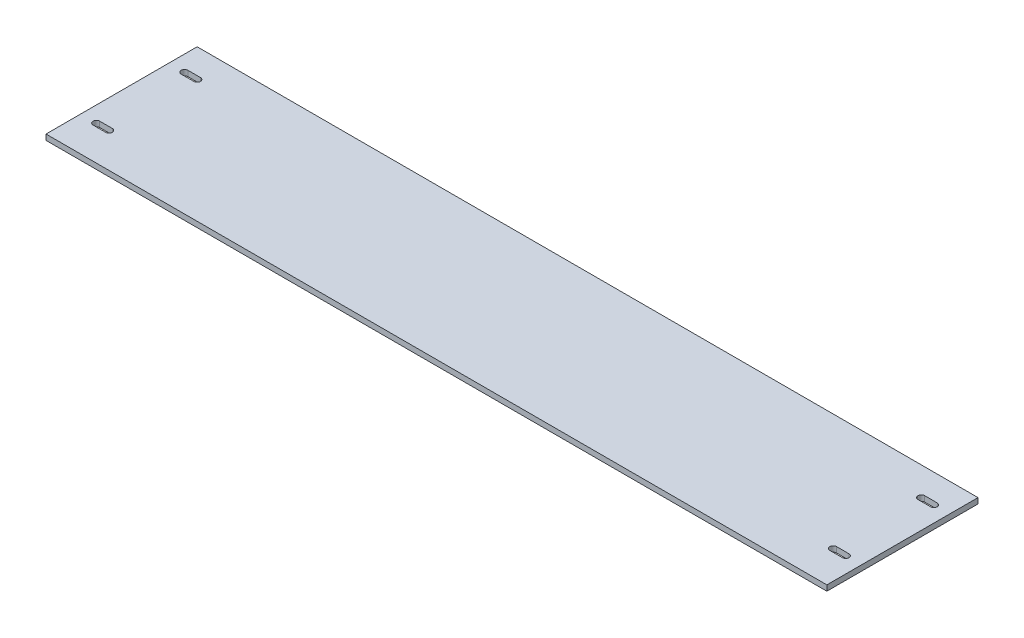
ISO-10303-21;
HEADER;
FILE_DESCRIPTION(('STEP AP214'),'2;1');
FILE_NAME('part.step','',(''),(''),'','','');
FILE_SCHEMA(('AUTOMOTIVE_DESIGN { 1 0 10303 214 1 1 1 1 }'));
ENDSEC;
DATA;
#1=APPLICATION_CONTEXT('core data for automotive mechanical design processes');
#2=APPLICATION_PROTOCOL_DEFINITION('international standard','automotive_design',2000,#1);
#3=PRODUCT_CONTEXT('',#1,'mechanical');
#4=PRODUCT('Part','Part','',(#3));
#5=PRODUCT_RELATED_PRODUCT_CATEGORY('part','',(#4));
#6=PRODUCT_DEFINITION_FORMATION('','',#4);
#7=PRODUCT_DEFINITION_CONTEXT('part definition',#1,'design');
#8=PRODUCT_DEFINITION('design','',#6,#7);
#9=PRODUCT_DEFINITION_SHAPE('','',#8);
#10=(LENGTH_UNIT() NAMED_UNIT(*) SI_UNIT(.MILLI.,.METRE.));
#11=(NAMED_UNIT(*) PLANE_ANGLE_UNIT() SI_UNIT($,.RADIAN.));
#12=(NAMED_UNIT(*) SI_UNIT($,.STERADIAN.) SOLID_ANGLE_UNIT());
#13=UNCERTAINTY_MEASURE_WITH_UNIT(LENGTH_MEASURE(1.E-05),#10,'distance_accuracy_value','');
#14=(GEOMETRIC_REPRESENTATION_CONTEXT(3) GLOBAL_UNCERTAINTY_ASSIGNED_CONTEXT((#13)) GLOBAL_UNIT_ASSIGNED_CONTEXT((#10,
#11,#12)) REPRESENTATION_CONTEXT('',''));
#15=CARTESIAN_POINT('',(0.,0.,0.));
#16=DIRECTION('',(0.,0.,1.));
#17=DIRECTION('',(1.,0.,0.));
#18=AXIS2_PLACEMENT_3D('',#15,#16,#17);
#19=CARTESIAN_POINT('',(0.,5.588,0.));
#20=DIRECTION('',(0.,-1.,0.));
#21=DIRECTION('',(0.,0.,-1.));
#22=AXIS2_PLACEMENT_3D('',#19,#20,#21);
#23=PLANE('',#22);
#24=CARTESIAN_POINT('',(771.525,5.588,-123.825));
#25=DIRECTION('',(0.,1.,0.));
#26=DIRECTION('',(0.,0.,1.));
#27=AXIS2_PLACEMENT_3D('',#24,#25,#26);
#28=CIRCLE('',#27,3.37819999999999);
#29=CARTESIAN_POINT('',(771.525,5.588,-120.4468));
#30=VERTEX_POINT('',#29);
#31=CARTESIAN_POINT('',(771.525,5.588,-127.2032));
#32=VERTEX_POINT('',#31);
#33=EDGE_CURVE('E206',#30,#32,#28,.T.);
#34=ORIENTED_EDGE('',*,*,#33,.F.);
#35=DIRECTION('',(1.,0.,0.));
#36=VECTOR('',#35,1.);
#37=CARTESIAN_POINT('',(771.525,5.588,-120.4468));
#38=LINE('',#37,#36);
#39=CARTESIAN_POINT('',(758.825,5.588,-120.4468));
#40=VERTEX_POINT('',#39);
#41=EDGE_CURVE('E214',#40,#30,#38,.T.);
#42=ORIENTED_EDGE('',*,*,#41,.F.);
#43=CARTESIAN_POINT('',(758.825,5.588,-123.825));
#44=DIRECTION('',(0.,1.,0.));
#45=DIRECTION('',(0.,0.,1.));
#46=AXIS2_PLACEMENT_3D('',#43,#44,#45);
#47=CIRCLE('',#46,3.37819999999999);
#48=CARTESIAN_POINT('',(758.825,5.588,-127.2032));
#49=VERTEX_POINT('',#48);
#50=EDGE_CURVE('E211',#49,#40,#47,.T.);
#51=ORIENTED_EDGE('',*,*,#50,.F.);
#52=DIRECTION('',(-1.,0.,0.));
#53=VECTOR('',#52,1.);
#54=CARTESIAN_POINT('',(771.525,5.588,-127.2032));
#55=LINE('',#54,#53);
#56=EDGE_CURVE('E208',#32,#49,#55,.T.);
#57=ORIENTED_EDGE('',*,*,#56,.F.);
#58=EDGE_LOOP('',(#34,#42,#51,#57));
#59=FACE_BOUND('',#58,.T.);
#60=CARTESIAN_POINT('',(15.875,5.588,-34.925));
#61=DIRECTION('',(0.,1.,0.));
#62=DIRECTION('',(0.,0.,1.));
#63=AXIS2_PLACEMENT_3D('',#60,#61,#62);
#64=CIRCLE('',#63,3.3782);
#65=CARTESIAN_POINT('',(15.875,5.588,-38.3032));
#66=VERTEX_POINT('',#65);
#67=CARTESIAN_POINT('',(15.875,5.588,-31.5468));
#68=VERTEX_POINT('',#67);
#69=EDGE_CURVE('E268',#66,#68,#64,.T.);
#70=ORIENTED_EDGE('',*,*,#69,.F.);
#71=DIRECTION('',(-1.,0.,0.));
#72=VECTOR('',#71,1.);
#73=CARTESIAN_POINT('',(15.875,5.588,-38.3032));
#74=LINE('',#73,#72);
#75=CARTESIAN_POINT('',(28.575,5.588,-38.3032));
#76=VERTEX_POINT('',#75);
#77=EDGE_CURVE('E276',#76,#66,#74,.T.);
#78=ORIENTED_EDGE('',*,*,#77,.F.);
#79=CARTESIAN_POINT('',(28.575,5.588,-34.925));
#80=DIRECTION('',(0.,1.,0.));
#81=DIRECTION('',(0.,0.,1.));
#82=AXIS2_PLACEMENT_3D('',#79,#80,#81);
#83=CIRCLE('',#82,3.3782);
#84=CARTESIAN_POINT('',(28.575,5.588,-31.5468));
#85=VERTEX_POINT('',#84);
#86=EDGE_CURVE('E273',#85,#76,#83,.T.);
#87=ORIENTED_EDGE('',*,*,#86,.F.);
#88=DIRECTION('',(1.,0.,0.));
#89=VECTOR('',#88,1.);
#90=CARTESIAN_POINT('',(15.875,5.588,-31.5468));
#91=LINE('',#90,#89);
#92=EDGE_CURVE('E270',#68,#85,#91,.T.);
#93=ORIENTED_EDGE('',*,*,#92,.F.);
#94=EDGE_LOOP('',(#70,#78,#87,#93));
#95=FACE_BOUND('',#94,.T.);
#96=DIRECTION('',(0.,0.,1.));
#97=VECTOR('',#96,1.);
#98=CARTESIAN_POINT('',(0.,5.588,0.));
#99=LINE('',#98,#97);
#100=CARTESIAN_POINT('',(0.,5.588,-152.4));
#101=VERTEX_POINT('',#100);
#102=CARTESIAN_POINT('',(0.,5.588,0.));
#103=VERTEX_POINT('',#102);
#104=EDGE_CURVE('E299',#101,#103,#99,.T.);
#105=ORIENTED_EDGE('',*,*,#104,.T.);
#106=DIRECTION('',(1.,0.,0.));
#107=VECTOR('',#106,1.);
#108=CARTESIAN_POINT('',(0.,5.588,0.));
#109=LINE('',#108,#107);
#110=CARTESIAN_POINT('',(787.4,5.588,0.));
#111=VERTEX_POINT('',#110);
#112=EDGE_CURVE('E302',#103,#111,#109,.T.);
#113=ORIENTED_EDGE('',*,*,#112,.T.);
#114=DIRECTION('',(0.,0.,-1.));
#115=VECTOR('',#114,1.);
#116=CARTESIAN_POINT('',(787.4,5.588,0.));
#117=LINE('',#116,#115);
#118=CARTESIAN_POINT('',(787.4,5.588,-152.4));
#119=VERTEX_POINT('',#118);
#120=EDGE_CURVE('E305',#111,#119,#117,.T.);
#121=ORIENTED_EDGE('',*,*,#120,.T.);
#122=DIRECTION('',(-1.,0.,0.));
#123=VECTOR('',#122,1.);
#124=CARTESIAN_POINT('',(0.,5.588,-152.4));
#125=LINE('',#124,#123);
#126=EDGE_CURVE('E307',#119,#101,#125,.T.);
#127=ORIENTED_EDGE('',*,*,#126,.T.);
#128=EDGE_LOOP('',(#105,#113,#121,#127));
#129=FACE_BOUND('',#128,.T.);
#130=CARTESIAN_POINT('',(15.875,5.588,-123.825));
#131=DIRECTION('',(0.,1.,0.));
#132=DIRECTION('',(0.,0.,1.));
#133=AXIS2_PLACEMENT_3D('',#130,#131,#132);
#134=CIRCLE('',#133,3.37819999999998);
#135=CARTESIAN_POINT('',(15.875,5.588,-127.2032));
#136=VERTEX_POINT('',#135);
#137=CARTESIAN_POINT('',(15.875,5.588,-120.4468));
#138=VERTEX_POINT('',#137);
#139=EDGE_CURVE('E237',#136,#138,#134,.T.);
#140=ORIENTED_EDGE('',*,*,#139,.F.);
#141=DIRECTION('',(-1.,0.,0.));
#142=VECTOR('',#141,1.);
#143=CARTESIAN_POINT('',(15.875,5.588,-127.2032));
#144=LINE('',#143,#142);
#145=CARTESIAN_POINT('',(28.575,5.588,-127.2032));
#146=VERTEX_POINT('',#145);
#147=EDGE_CURVE('E245',#146,#136,#144,.T.);
#148=ORIENTED_EDGE('',*,*,#147,.F.);
#149=CARTESIAN_POINT('',(28.575,5.588,-123.825));
#150=DIRECTION('',(0.,1.,0.));
#151=DIRECTION('',(0.,0.,1.));
#152=AXIS2_PLACEMENT_3D('',#149,#150,#151);
#153=CIRCLE('',#152,3.37819999999998);
#154=CARTESIAN_POINT('',(28.575,5.588,-120.4468));
#155=VERTEX_POINT('',#154);
#156=EDGE_CURVE('E242',#155,#146,#153,.T.);
#157=ORIENTED_EDGE('',*,*,#156,.F.);
#158=DIRECTION('',(1.,0.,0.));
#159=VECTOR('',#158,1.);
#160=CARTESIAN_POINT('',(15.875,5.588,-120.4468));
#161=LINE('',#160,#159);
#162=EDGE_CURVE('E239',#138,#155,#161,.T.);
#163=ORIENTED_EDGE('',*,*,#162,.F.);
#164=EDGE_LOOP('',(#140,#148,#157,#163));
#165=FACE_BOUND('',#164,.T.);
#166=CARTESIAN_POINT('',(771.525,5.588,-34.925));
#167=DIRECTION('',(0.,1.,0.));
#168=DIRECTION('',(0.,0.,1.));
#169=AXIS2_PLACEMENT_3D('',#166,#167,#168);
#170=CIRCLE('',#169,3.3782);
#171=CARTESIAN_POINT('',(771.525,5.588,-31.5468));
#172=VERTEX_POINT('',#171);
#173=CARTESIAN_POINT('',(771.525,5.588,-38.3032));
#174=VERTEX_POINT('',#173);
#175=EDGE_CURVE('E170',#172,#174,#170,.T.);
#176=ORIENTED_EDGE('',*,*,#175,.F.);
#177=DIRECTION('',(1.,0.,0.));
#178=VECTOR('',#177,1.);
#179=CARTESIAN_POINT('',(771.525,5.588,-31.5468));
#180=LINE('',#179,#178);
#181=CARTESIAN_POINT('',(758.825,5.588,-31.5468));
#182=VERTEX_POINT('',#181);
#183=EDGE_CURVE('E192',#182,#172,#180,.T.);
#184=ORIENTED_EDGE('',*,*,#183,.F.);
#185=CARTESIAN_POINT('',(758.825,5.588,-34.925));
#186=DIRECTION('',(0.,1.,0.));
#187=DIRECTION('',(0.,0.,1.));
#188=AXIS2_PLACEMENT_3D('',#185,#186,#187);
#189=CIRCLE('',#188,3.3782);
#190=CARTESIAN_POINT('',(758.825,5.588,-38.3032));
#191=VERTEX_POINT('',#190);
#192=EDGE_CURVE('E190',#191,#182,#189,.T.);
#193=ORIENTED_EDGE('',*,*,#192,.F.);
#194=DIRECTION('',(-1.,0.,0.));
#195=VECTOR('',#194,1.);
#196=CARTESIAN_POINT('',(771.525,5.588,-38.3032));
#197=LINE('',#196,#195);
#198=EDGE_CURVE('E178',#174,#191,#197,.T.);
#199=ORIENTED_EDGE('',*,*,#198,.F.);
#200=EDGE_LOOP('',(#176,#184,#193,#199));
#201=FACE_BOUND('',#200,.T.);
#202=ADVANCED_FACE('F33',(#59,#95,#129,#165,#201),#23,.F.);
#203=CARTESIAN_POINT('',(0.,0.,0.));
#204=DIRECTION('',(0.,-1.,0.));
#205=DIRECTION('',(0.,0.,-1.));
#206=AXIS2_PLACEMENT_3D('',#203,#204,#205);
#207=PLANE('',#206);
#208=DIRECTION('',(0.,0.,1.));
#209=VECTOR('',#208,1.);
#210=CARTESIAN_POINT('',(0.,0.,0.));
#211=LINE('',#210,#209);
#212=CARTESIAN_POINT('',(0.,0.,-152.4));
#213=VERTEX_POINT('',#212);
#214=CARTESIAN_POINT('',(0.,0.,0.));
#215=VERTEX_POINT('',#214);
#216=EDGE_CURVE('E298',#213,#215,#211,.T.);
#217=ORIENTED_EDGE('',*,*,#216,.F.);
#218=DIRECTION('',(-1.,0.,0.));
#219=VECTOR('',#218,1.);
#220=CARTESIAN_POINT('',(0.,0.,-152.4));
#221=LINE('',#220,#219);
#222=CARTESIAN_POINT('',(787.4,0.,-152.4));
#223=VERTEX_POINT('',#222);
#224=EDGE_CURVE('E303',#223,#213,#221,.T.);
#225=ORIENTED_EDGE('',*,*,#224,.F.);
#226=DIRECTION('',(0.,0.,-1.));
#227=VECTOR('',#226,1.);
#228=CARTESIAN_POINT('',(787.4,0.,0.));
#229=LINE('',#228,#227);
#230=CARTESIAN_POINT('',(787.4,0.,0.));
#231=VERTEX_POINT('',#230);
#232=EDGE_CURVE('E314',#231,#223,#229,.T.);
#233=ORIENTED_EDGE('',*,*,#232,.F.);
#234=DIRECTION('',(1.,0.,0.));
#235=VECTOR('',#234,1.);
#236=CARTESIAN_POINT('',(0.,0.,0.));
#237=LINE('',#236,#235);
#238=EDGE_CURVE('E312',#215,#231,#237,.T.);
#239=ORIENTED_EDGE('',*,*,#238,.F.);
#240=EDGE_LOOP('',(#217,#225,#233,#239));
#241=FACE_BOUND('',#240,.T.);
#242=DIRECTION('',(-1.,0.,0.));
#243=VECTOR('',#242,1.);
#244=CARTESIAN_POINT('',(15.875,0.,-38.3032));
#245=LINE('',#244,#243);
#246=CARTESIAN_POINT('',(28.575,0.,-38.3032));
#247=VERTEX_POINT('',#246);
#248=CARTESIAN_POINT('',(15.875,0.,-38.3032));
#249=VERTEX_POINT('',#248);
#250=EDGE_CURVE('E271',#247,#249,#245,.T.);
#251=ORIENTED_EDGE('',*,*,#250,.T.);
#252=CARTESIAN_POINT('',(15.875,0.,-34.925));
#253=DIRECTION('',(0.,1.,0.));
#254=DIRECTION('',(0.,0.,1.));
#255=AXIS2_PLACEMENT_3D('',#252,#253,#254);
#256=CIRCLE('',#255,3.3782);
#257=CARTESIAN_POINT('',(15.875,0.,-31.5468));
#258=VERTEX_POINT('',#257);
#259=EDGE_CURVE('E267',#249,#258,#256,.T.);
#260=ORIENTED_EDGE('',*,*,#259,.T.);
#261=DIRECTION('',(1.,0.,0.));
#262=VECTOR('',#261,1.);
#263=CARTESIAN_POINT('',(15.875,0.,-31.5468));
#264=LINE('',#263,#262);
#265=CARTESIAN_POINT('',(28.575,0.,-31.5468));
#266=VERTEX_POINT('',#265);
#267=EDGE_CURVE('E281',#258,#266,#264,.T.);
#268=ORIENTED_EDGE('',*,*,#267,.T.);
#269=CARTESIAN_POINT('',(28.575,0.,-34.925));
#270=DIRECTION('',(0.,1.,0.));
#271=DIRECTION('',(0.,0.,1.));
#272=AXIS2_PLACEMENT_3D('',#269,#270,#271);
#273=CIRCLE('',#272,3.3782);
#274=EDGE_CURVE('E284',#266,#247,#273,.T.);
#275=ORIENTED_EDGE('',*,*,#274,.T.);
#276=EDGE_LOOP('',(#251,#260,#268,#275));
#277=FACE_BOUND('',#276,.T.);
#278=DIRECTION('',(-1.,0.,0.));
#279=VECTOR('',#278,1.);
#280=CARTESIAN_POINT('',(15.875,0.,-127.2032));
#281=LINE('',#280,#279);
#282=CARTESIAN_POINT('',(28.575,0.,-127.2032));
#283=VERTEX_POINT('',#282);
#284=CARTESIAN_POINT('',(15.875,0.,-127.2032));
#285=VERTEX_POINT('',#284);
#286=EDGE_CURVE('E240',#283,#285,#281,.T.);
#287=ORIENTED_EDGE('',*,*,#286,.T.);
#288=CARTESIAN_POINT('',(15.875,0.,-123.825));
#289=DIRECTION('',(0.,1.,0.));
#290=DIRECTION('',(0.,0.,1.));
#291=AXIS2_PLACEMENT_3D('',#288,#289,#290);
#292=CIRCLE('',#291,3.37819999999998);
#293=CARTESIAN_POINT('',(15.875,0.,-120.4468));
#294=VERTEX_POINT('',#293);
#295=EDGE_CURVE('E236',#285,#294,#292,.T.);
#296=ORIENTED_EDGE('',*,*,#295,.T.);
#297=DIRECTION('',(1.,0.,0.));
#298=VECTOR('',#297,1.);
#299=CARTESIAN_POINT('',(15.875,0.,-120.4468));
#300=LINE('',#299,#298);
#301=CARTESIAN_POINT('',(28.575,0.,-120.4468));
#302=VERTEX_POINT('',#301);
#303=EDGE_CURVE('E250',#294,#302,#300,.T.);
#304=ORIENTED_EDGE('',*,*,#303,.T.);
#305=CARTESIAN_POINT('',(28.575,0.,-123.825));
#306=DIRECTION('',(0.,1.,0.));
#307=DIRECTION('',(0.,0.,1.));
#308=AXIS2_PLACEMENT_3D('',#305,#306,#307);
#309=CIRCLE('',#308,3.37819999999998);
#310=EDGE_CURVE('E253',#302,#283,#309,.T.);
#311=ORIENTED_EDGE('',*,*,#310,.T.);
#312=EDGE_LOOP('',(#287,#296,#304,#311));
#313=FACE_BOUND('',#312,.T.);
#314=DIRECTION('',(1.,0.,0.));
#315=VECTOR('',#314,1.);
#316=CARTESIAN_POINT('',(771.525,0.,-120.4468));
#317=LINE('',#316,#315);
#318=CARTESIAN_POINT('',(758.825,0.,-120.4468));
#319=VERTEX_POINT('',#318);
#320=CARTESIAN_POINT('',(771.525,0.,-120.4468));
#321=VERTEX_POINT('',#320);
#322=EDGE_CURVE('E209',#319,#321,#317,.T.);
#323=ORIENTED_EDGE('',*,*,#322,.T.);
#324=CARTESIAN_POINT('',(771.525,0.,-123.825));
#325=DIRECTION('',(0.,1.,0.));
#326=DIRECTION('',(0.,0.,1.));
#327=AXIS2_PLACEMENT_3D('',#324,#325,#326);
#328=CIRCLE('',#327,3.37819999999999);
#329=CARTESIAN_POINT('',(771.525,0.,-127.2032));
#330=VERTEX_POINT('',#329);
#331=EDGE_CURVE('E186',#321,#330,#328,.T.);
#332=ORIENTED_EDGE('',*,*,#331,.T.);
#333=DIRECTION('',(-1.,0.,0.));
#334=VECTOR('',#333,1.);
#335=CARTESIAN_POINT('',(771.525,0.,-127.2032));
#336=LINE('',#335,#334);
#337=CARTESIAN_POINT('',(758.825,0.,-127.2032));
#338=VERTEX_POINT('',#337);
#339=EDGE_CURVE('E219',#330,#338,#336,.T.);
#340=ORIENTED_EDGE('',*,*,#339,.T.);
#341=CARTESIAN_POINT('',(758.825,0.,-123.825));
#342=DIRECTION('',(0.,1.,0.));
#343=DIRECTION('',(0.,0.,1.));
#344=AXIS2_PLACEMENT_3D('',#341,#342,#343);
#345=CIRCLE('',#344,3.37819999999999);
#346=EDGE_CURVE('E222',#338,#319,#345,.T.);
#347=ORIENTED_EDGE('',*,*,#346,.T.);
#348=EDGE_LOOP('',(#323,#332,#340,#347));
#349=FACE_BOUND('',#348,.T.);
#350=DIRECTION('',(1.,0.,0.));
#351=VECTOR('',#350,1.);
#352=CARTESIAN_POINT('',(771.525,0.,-31.5468));
#353=LINE('',#352,#351);
#354=CARTESIAN_POINT('',(758.825,0.,-31.5468));
#355=VERTEX_POINT('',#354);
#356=CARTESIAN_POINT('',(771.525,0.,-31.5468));
#357=VERTEX_POINT('',#356);
#358=EDGE_CURVE('E179',#355,#357,#353,.T.);
#359=ORIENTED_EDGE('',*,*,#358,.T.);
#360=CARTESIAN_POINT('',(771.525,0.,-34.925));
#361=DIRECTION('',(0.,1.,0.));
#362=DIRECTION('',(0.,0.,1.));
#363=AXIS2_PLACEMENT_3D('',#360,#361,#362);
#364=CIRCLE('',#363,3.3782);
#365=CARTESIAN_POINT('',(771.525,0.,-38.3032));
#366=VERTEX_POINT('',#365);
#367=EDGE_CURVE('E56',#357,#366,#364,.T.);
#368=ORIENTED_EDGE('',*,*,#367,.T.);
#369=DIRECTION('',(-1.,0.,0.));
#370=VECTOR('',#369,1.);
#371=CARTESIAN_POINT('',(771.525,0.,-38.3032));
#372=LINE('',#371,#370);
#373=CARTESIAN_POINT('',(758.825,0.,-38.3032));
#374=VERTEX_POINT('',#373);
#375=EDGE_CURVE('E185',#366,#374,#372,.T.);
#376=ORIENTED_EDGE('',*,*,#375,.T.);
#377=CARTESIAN_POINT('',(758.825,0.,-34.925));
#378=DIRECTION('',(0.,1.,0.));
#379=DIRECTION('',(0.,0.,1.));
#380=AXIS2_PLACEMENT_3D('',#377,#378,#379);
#381=CIRCLE('',#380,3.3782);
#382=EDGE_CURVE('E198',#374,#355,#381,.T.);
#383=ORIENTED_EDGE('',*,*,#382,.T.);
#384=EDGE_LOOP('',(#359,#368,#376,#383));
#385=FACE_BOUND('',#384,.T.);
#386=ADVANCED_FACE('F332',(#241,#277,#313,#349,#385),#207,.T.);
#387=CARTESIAN_POINT('',(0.,5.588,0.));
#388=DIRECTION('',(1.,0.,0.));
#389=DIRECTION('',(0.,0.,-1.));
#390=AXIS2_PLACEMENT_3D('',#387,#388,#389);
#391=PLANE('',#390);
#392=ORIENTED_EDGE('',*,*,#216,.T.);
#393=DIRECTION('',(0.,-1.,0.));
#394=VECTOR('',#393,1.);
#395=CARTESIAN_POINT('',(0.,5.588,0.));
#396=LINE('',#395,#394);
#397=EDGE_CURVE('E11',#103,#215,#396,.T.);
#398=ORIENTED_EDGE('',*,*,#397,.F.);
#399=ORIENTED_EDGE('',*,*,#104,.F.);
#400=DIRECTION('',(0.,-1.,0.));
#401=VECTOR('',#400,1.);
#402=CARTESIAN_POINT('',(0.,5.588,-152.4));
#403=LINE('',#402,#401);
#404=EDGE_CURVE('E309',#101,#213,#403,.T.);
#405=ORIENTED_EDGE('',*,*,#404,.T.);
#406=EDGE_LOOP('',(#392,#398,#399,#405));
#407=FACE_BOUND('',#406,.T.);
#408=ADVANCED_FACE('F35',(#407),#391,.F.);
#409=CARTESIAN_POINT('',(0.,5.588,0.));
#410=DIRECTION('',(0.,0.,-1.));
#411=DIRECTION('',(-1.,0.,0.));
#412=AXIS2_PLACEMENT_3D('',#409,#410,#411);
#413=PLANE('',#412);
#414=ORIENTED_EDGE('',*,*,#238,.T.);
#415=DIRECTION('',(0.,-1.,0.));
#416=VECTOR('',#415,1.);
#417=CARTESIAN_POINT('',(787.4,5.588,0.));
#418=LINE('',#417,#416);
#419=EDGE_CURVE('E41',#111,#231,#418,.T.);
#420=ORIENTED_EDGE('',*,*,#419,.F.);
#421=ORIENTED_EDGE('',*,*,#112,.F.);
#422=ORIENTED_EDGE('',*,*,#397,.T.);
#423=EDGE_LOOP('',(#414,#420,#421,#422));
#424=FACE_BOUND('',#423,.T.);
#425=ADVANCED_FACE('F343',(#424),#413,.F.);
#426=CARTESIAN_POINT('',(787.4,5.588,0.));
#427=DIRECTION('',(-1.,0.,0.));
#428=DIRECTION('',(0.,0.,1.));
#429=AXIS2_PLACEMENT_3D('',#426,#427,#428);
#430=PLANE('',#429);
#431=ORIENTED_EDGE('',*,*,#232,.T.);
#432=DIRECTION('',(0.,-1.,0.));
#433=VECTOR('',#432,1.);
#434=CARTESIAN_POINT('',(787.4,5.588,-152.4));
#435=LINE('',#434,#433);
#436=EDGE_CURVE('E319',#119,#223,#435,.T.);
#437=ORIENTED_EDGE('',*,*,#436,.F.);
#438=ORIENTED_EDGE('',*,*,#120,.F.);
#439=ORIENTED_EDGE('',*,*,#419,.T.);
#440=EDGE_LOOP('',(#431,#437,#438,#439));
#441=FACE_BOUND('',#440,.T.);
#442=ADVANCED_FACE('F326',(#441),#430,.F.);
#443=CARTESIAN_POINT('',(0.,5.588,-152.4));
#444=DIRECTION('',(0.,0.,1.));
#445=DIRECTION('',(1.,0.,0.));
#446=AXIS2_PLACEMENT_3D('',#443,#444,#445);
#447=PLANE('',#446);
#448=ORIENTED_EDGE('',*,*,#224,.T.);
#449=ORIENTED_EDGE('',*,*,#404,.F.);
#450=ORIENTED_EDGE('',*,*,#126,.F.);
#451=ORIENTED_EDGE('',*,*,#436,.T.);
#452=EDGE_LOOP('',(#448,#449,#450,#451));
#453=FACE_BOUND('',#452,.T.);
#454=ADVANCED_FACE('F336',(#453),#447,.F.);
#455=CARTESIAN_POINT('',(15.875,5.588,-34.925));
#456=DIRECTION('',(0.,-1.,0.));
#457=DIRECTION('',(0.,0.,-1.));
#458=AXIS2_PLACEMENT_3D('',#455,#456,#457);
#459=CYLINDRICAL_SURFACE('',#458,3.3782);
#460=ORIENTED_EDGE('',*,*,#259,.F.);
#461=DIRECTION('',(0.,-1.,0.));
#462=VECTOR('',#461,1.);
#463=CARTESIAN_POINT('',(15.875,5.588,-38.3032));
#464=LINE('',#463,#462);
#465=EDGE_CURVE('E278',#66,#249,#464,.T.);
#466=ORIENTED_EDGE('',*,*,#465,.F.);
#467=ORIENTED_EDGE('',*,*,#69,.T.);
#468=DIRECTION('',(0.,-1.,0.));
#469=VECTOR('',#468,1.);
#470=CARTESIAN_POINT('',(15.875,5.588,-31.5468));
#471=LINE('',#470,#469);
#472=EDGE_CURVE('E295',#68,#258,#471,.T.);
#473=ORIENTED_EDGE('',*,*,#472,.T.);
#474=EDGE_LOOP('',(#460,#466,#467,#473));
#475=FACE_BOUND('',#474,.T.);
#476=ADVANCED_FACE('F360',(#475),#459,.F.);
#477=CARTESIAN_POINT('',(15.875,5.588,-31.5468));
#478=DIRECTION('',(0.,0.,-1.));
#479=DIRECTION('',(-1.,0.,0.));
#480=AXIS2_PLACEMENT_3D('',#477,#478,#479);
#481=PLANE('',#480);
#482=ORIENTED_EDGE('',*,*,#267,.F.);
#483=ORIENTED_EDGE('',*,*,#472,.F.);
#484=ORIENTED_EDGE('',*,*,#92,.T.);
#485=DIRECTION('',(0.,-1.,0.));
#486=VECTOR('',#485,1.);
#487=CARTESIAN_POINT('',(28.575,5.588,-31.5468));
#488=LINE('',#487,#486);
#489=EDGE_CURVE('E293',#85,#266,#488,.T.);
#490=ORIENTED_EDGE('',*,*,#489,.T.);
#491=EDGE_LOOP('',(#482,#483,#484,#490));
#492=FACE_BOUND('',#491,.T.);
#493=ADVANCED_FACE('F367',(#492),#481,.T.);
#494=CARTESIAN_POINT('',(28.575,5.588,-34.925));
#495=DIRECTION('',(0.,-1.,0.));
#496=DIRECTION('',(0.,0.,-1.));
#497=AXIS2_PLACEMENT_3D('',#494,#495,#496);
#498=CYLINDRICAL_SURFACE('',#497,3.3782);
#499=ORIENTED_EDGE('',*,*,#274,.F.);
#500=ORIENTED_EDGE('',*,*,#489,.F.);
#501=ORIENTED_EDGE('',*,*,#86,.T.);
#502=DIRECTION('',(0.,-1.,0.));
#503=VECTOR('',#502,1.);
#504=CARTESIAN_POINT('',(28.575,5.588,-38.3032));
#505=LINE('',#504,#503);
#506=EDGE_CURVE('E291',#76,#247,#505,.T.);
#507=ORIENTED_EDGE('',*,*,#506,.T.);
#508=EDGE_LOOP('',(#499,#500,#501,#507));
#509=FACE_BOUND('',#508,.T.);
#510=ADVANCED_FACE('F372',(#509),#498,.F.);
#511=CARTESIAN_POINT('',(15.875,5.588,-38.3032));
#512=DIRECTION('',(0.,0.,1.));
#513=DIRECTION('',(1.,0.,0.));
#514=AXIS2_PLACEMENT_3D('',#511,#512,#513);
#515=PLANE('',#514);
#516=ORIENTED_EDGE('',*,*,#250,.F.);
#517=ORIENTED_EDGE('',*,*,#506,.F.);
#518=ORIENTED_EDGE('',*,*,#77,.T.);
#519=ORIENTED_EDGE('',*,*,#465,.T.);
#520=EDGE_LOOP('',(#516,#517,#518,#519));
#521=FACE_BOUND('',#520,.T.);
#522=ADVANCED_FACE('F379',(#521),#515,.T.);
#523=CARTESIAN_POINT('',(15.875,5.588,-123.825));
#524=DIRECTION('',(0.,-1.,0.));
#525=DIRECTION('',(0.,0.,-1.));
#526=AXIS2_PLACEMENT_3D('',#523,#524,#525);
#527=CYLINDRICAL_SURFACE('',#526,3.37819999999998);
#528=ORIENTED_EDGE('',*,*,#295,.F.);
#529=DIRECTION('',(0.,-1.,0.));
#530=VECTOR('',#529,1.);
#531=CARTESIAN_POINT('',(15.875,5.588,-127.2032));
#532=LINE('',#531,#530);
#533=EDGE_CURVE('E247',#136,#285,#532,.T.);
#534=ORIENTED_EDGE('',*,*,#533,.F.);
#535=ORIENTED_EDGE('',*,*,#139,.T.);
#536=DIRECTION('',(0.,-1.,0.));
#537=VECTOR('',#536,1.);
#538=CARTESIAN_POINT('',(15.875,5.588,-120.4468));
#539=LINE('',#538,#537);
#540=EDGE_CURVE('E264',#138,#294,#539,.T.);
#541=ORIENTED_EDGE('',*,*,#540,.T.);
#542=EDGE_LOOP('',(#528,#534,#535,#541));
#543=FACE_BOUND('',#542,.T.);
#544=ADVANCED_FACE('F392',(#543),#527,.F.);
#545=CARTESIAN_POINT('',(15.875,5.588,-120.4468));
#546=DIRECTION('',(0.,0.,-1.));
#547=DIRECTION('',(-1.,0.,0.));
#548=AXIS2_PLACEMENT_3D('',#545,#546,#547);
#549=PLANE('',#548);
#550=ORIENTED_EDGE('',*,*,#303,.F.);
#551=ORIENTED_EDGE('',*,*,#540,.F.);
#552=ORIENTED_EDGE('',*,*,#162,.T.);
#553=DIRECTION('',(0.,-1.,0.));
#554=VECTOR('',#553,1.);
#555=CARTESIAN_POINT('',(28.575,5.588,-120.4468));
#556=LINE('',#555,#554);
#557=EDGE_CURVE('E262',#155,#302,#556,.T.);
#558=ORIENTED_EDGE('',*,*,#557,.T.);
#559=EDGE_LOOP('',(#550,#551,#552,#558));
#560=FACE_BOUND('',#559,.T.);
#561=ADVANCED_FACE('F397',(#560),#549,.T.);
#562=CARTESIAN_POINT('',(28.575,5.588,-123.825));
#563=DIRECTION('',(0.,-1.,0.));
#564=DIRECTION('',(0.,0.,-1.));
#565=AXIS2_PLACEMENT_3D('',#562,#563,#564);
#566=CYLINDRICAL_SURFACE('',#565,3.37819999999998);
#567=ORIENTED_EDGE('',*,*,#310,.F.);
#568=ORIENTED_EDGE('',*,*,#557,.F.);
#569=ORIENTED_EDGE('',*,*,#156,.T.);
#570=DIRECTION('',(0.,-1.,0.));
#571=VECTOR('',#570,1.);
#572=CARTESIAN_POINT('',(28.575,5.588,-127.2032));
#573=LINE('',#572,#571);
#574=EDGE_CURVE('E260',#146,#283,#573,.T.);
#575=ORIENTED_EDGE('',*,*,#574,.T.);
#576=EDGE_LOOP('',(#567,#568,#569,#575));
#577=FACE_BOUND('',#576,.T.);
#578=ADVANCED_FACE('F401',(#577),#566,.F.);
#579=CARTESIAN_POINT('',(15.875,5.588,-127.2032));
#580=DIRECTION('',(0.,0.,1.));
#581=DIRECTION('',(1.,0.,0.));
#582=AXIS2_PLACEMENT_3D('',#579,#580,#581);
#583=PLANE('',#582);
#584=ORIENTED_EDGE('',*,*,#286,.F.);
#585=ORIENTED_EDGE('',*,*,#574,.F.);
#586=ORIENTED_EDGE('',*,*,#147,.T.);
#587=ORIENTED_EDGE('',*,*,#533,.T.);
#588=EDGE_LOOP('',(#584,#585,#586,#587));
#589=FACE_BOUND('',#588,.T.);
#590=ADVANCED_FACE('F405',(#589),#583,.T.);
#591=CARTESIAN_POINT('',(771.525,5.588,-123.825));
#592=DIRECTION('',(0.,-1.,0.));
#593=DIRECTION('',(0.,0.,-1.));
#594=AXIS2_PLACEMENT_3D('',#591,#592,#593);
#595=CYLINDRICAL_SURFACE('',#594,3.37819999999999);
#596=ORIENTED_EDGE('',*,*,#331,.F.);
#597=DIRECTION('',(0.,-1.,0.));
#598=VECTOR('',#597,1.);
#599=CARTESIAN_POINT('',(771.525,5.588,-120.4468));
#600=LINE('',#599,#598);
#601=EDGE_CURVE('E216',#30,#321,#600,.T.);
#602=ORIENTED_EDGE('',*,*,#601,.F.);
#603=ORIENTED_EDGE('',*,*,#33,.T.);
#604=DIRECTION('',(0.,-1.,0.));
#605=VECTOR('',#604,1.);
#606=CARTESIAN_POINT('',(771.525,5.588,-127.2032));
#607=LINE('',#606,#605);
#608=EDGE_CURVE('E233',#32,#330,#607,.T.);
#609=ORIENTED_EDGE('',*,*,#608,.T.);
#610=EDGE_LOOP('',(#596,#602,#603,#609));
#611=FACE_BOUND('',#610,.T.);
#612=ADVANCED_FACE('F409',(#611),#595,.F.);
#613=CARTESIAN_POINT('',(771.525,5.588,-127.2032));
#614=DIRECTION('',(0.,0.,1.));
#615=DIRECTION('',(1.,0.,0.));
#616=AXIS2_PLACEMENT_3D('',#613,#614,#615);
#617=PLANE('',#616);
#618=ORIENTED_EDGE('',*,*,#339,.F.);
#619=ORIENTED_EDGE('',*,*,#608,.F.);
#620=ORIENTED_EDGE('',*,*,#56,.T.);
#621=DIRECTION('',(0.,-1.,0.));
#622=VECTOR('',#621,1.);
#623=CARTESIAN_POINT('',(758.825,5.588,-127.2032));
#624=LINE('',#623,#622);
#625=EDGE_CURVE('E231',#49,#338,#624,.T.);
#626=ORIENTED_EDGE('',*,*,#625,.T.);
#627=EDGE_LOOP('',(#618,#619,#620,#626));
#628=FACE_BOUND('',#627,.T.);
#629=ADVANCED_FACE('F413',(#628),#617,.T.);
#630=CARTESIAN_POINT('',(758.825,5.588,-123.825));
#631=DIRECTION('',(0.,-1.,0.));
#632=DIRECTION('',(0.,0.,-1.));
#633=AXIS2_PLACEMENT_3D('',#630,#631,#632);
#634=CYLINDRICAL_SURFACE('',#633,3.37819999999999);
#635=ORIENTED_EDGE('',*,*,#346,.F.);
#636=ORIENTED_EDGE('',*,*,#625,.F.);
#637=ORIENTED_EDGE('',*,*,#50,.T.);
#638=DIRECTION('',(0.,-1.,0.));
#639=VECTOR('',#638,1.);
#640=CARTESIAN_POINT('',(758.825,5.588,-120.4468));
#641=LINE('',#640,#639);
#642=EDGE_CURVE('E229',#40,#319,#641,.T.);
#643=ORIENTED_EDGE('',*,*,#642,.T.);
#644=EDGE_LOOP('',(#635,#636,#637,#643));
#645=FACE_BOUND('',#644,.T.);
#646=ADVANCED_FACE('F417',(#645),#634,.F.);
#647=CARTESIAN_POINT('',(771.525,5.588,-120.4468));
#648=DIRECTION('',(0.,0.,-1.));
#649=DIRECTION('',(-1.,0.,0.));
#650=AXIS2_PLACEMENT_3D('',#647,#648,#649);
#651=PLANE('',#650);
#652=ORIENTED_EDGE('',*,*,#322,.F.);
#653=ORIENTED_EDGE('',*,*,#642,.F.);
#654=ORIENTED_EDGE('',*,*,#41,.T.);
#655=ORIENTED_EDGE('',*,*,#601,.T.);
#656=EDGE_LOOP('',(#652,#653,#654,#655));
#657=FACE_BOUND('',#656,.T.);
#658=ADVANCED_FACE('F421',(#657),#651,.T.);
#659=CARTESIAN_POINT('',(771.525,5.588,-34.925));
#660=DIRECTION('',(0.,-1.,0.));
#661=DIRECTION('',(0.,0.,-1.));
#662=AXIS2_PLACEMENT_3D('',#659,#660,#661);
#663=CYLINDRICAL_SURFACE('',#662,3.3782);
#664=ORIENTED_EDGE('',*,*,#367,.F.);
#665=DIRECTION('',(0.,-1.,0.));
#666=VECTOR('',#665,1.);
#667=CARTESIAN_POINT('',(771.525,5.588,-31.5468));
#668=LINE('',#667,#666);
#669=EDGE_CURVE('E174',#172,#357,#668,.T.);
#670=ORIENTED_EDGE('',*,*,#669,.F.);
#671=ORIENTED_EDGE('',*,*,#175,.T.);
#672=DIRECTION('',(0.,-1.,0.));
#673=VECTOR('',#672,1.);
#674=CARTESIAN_POINT('',(771.525,5.588,-38.3032));
#675=LINE('',#674,#673);
#676=EDGE_CURVE('E173',#174,#366,#675,.T.);
#677=ORIENTED_EDGE('',*,*,#676,.T.);
#678=EDGE_LOOP('',(#664,#670,#671,#677));
#679=FACE_BOUND('',#678,.T.);
#680=ADVANCED_FACE('F172',(#679),#663,.F.);
#681=CARTESIAN_POINT('',(771.525,5.588,-38.3032));
#682=DIRECTION('',(0.,0.,1.));
#683=DIRECTION('',(1.,0.,0.));
#684=AXIS2_PLACEMENT_3D('',#681,#682,#683);
#685=PLANE('',#684);
#686=ORIENTED_EDGE('',*,*,#375,.F.);
#687=ORIENTED_EDGE('',*,*,#676,.F.);
#688=ORIENTED_EDGE('',*,*,#198,.T.);
#689=DIRECTION('',(0.,-1.,0.));
#690=VECTOR('',#689,1.);
#691=CARTESIAN_POINT('',(758.825,5.588,-38.3032));
#692=LINE('',#691,#690);
#693=EDGE_CURVE('E187',#191,#374,#692,.T.);
#694=ORIENTED_EDGE('',*,*,#693,.T.);
#695=EDGE_LOOP('',(#686,#687,#688,#694));
#696=FACE_BOUND('',#695,.T.);
#697=ADVANCED_FACE('F182',(#696),#685,.T.);
#698=CARTESIAN_POINT('',(758.825,5.588,-34.925));
#699=DIRECTION('',(0.,-1.,0.));
#700=DIRECTION('',(0.,0.,-1.));
#701=AXIS2_PLACEMENT_3D('',#698,#699,#700);
#702=CYLINDRICAL_SURFACE('',#701,3.3782);
#703=ORIENTED_EDGE('',*,*,#382,.F.);
#704=ORIENTED_EDGE('',*,*,#693,.F.);
#705=ORIENTED_EDGE('',*,*,#192,.T.);
#706=DIRECTION('',(0.,-1.,0.));
#707=VECTOR('',#706,1.);
#708=CARTESIAN_POINT('',(758.825,5.588,-31.5468));
#709=LINE('',#708,#707);
#710=EDGE_CURVE('E48',#182,#355,#709,.T.);
#711=ORIENTED_EDGE('',*,*,#710,.T.);
#712=EDGE_LOOP('',(#703,#704,#705,#711));
#713=FACE_BOUND('',#712,.T.);
#714=ADVANCED_FACE('F430',(#713),#702,.F.);
#715=CARTESIAN_POINT('',(771.525,5.588,-31.5468));
#716=DIRECTION('',(0.,0.,-1.));
#717=DIRECTION('',(-1.,0.,0.));
#718=AXIS2_PLACEMENT_3D('',#715,#716,#717);
#719=PLANE('',#718);
#720=ORIENTED_EDGE('',*,*,#358,.F.);
#721=ORIENTED_EDGE('',*,*,#710,.F.);
#722=ORIENTED_EDGE('',*,*,#183,.T.);
#723=ORIENTED_EDGE('',*,*,#669,.T.);
#724=EDGE_LOOP('',(#720,#721,#722,#723));
#725=FACE_BOUND('',#724,.T.);
#726=ADVANCED_FACE('F433',(#725),#719,.T.);
#727=CLOSED_SHELL('',(#202,#386,#408,#425,#442,#454,#476,#493,#510,#522,#544,#561,#578,#590,
#612,#629,#646,#658,#680,#697,#714,#726));
#728=MANIFOLD_SOLID_BREP('B2',#727);
#729=ADVANCED_BREP_SHAPE_REPRESENTATION('',(#18,#728),#14);
#730=SHAPE_DEFINITION_REPRESENTATION(#9,#729);
ENDSEC;
END-ISO-10303-21;
